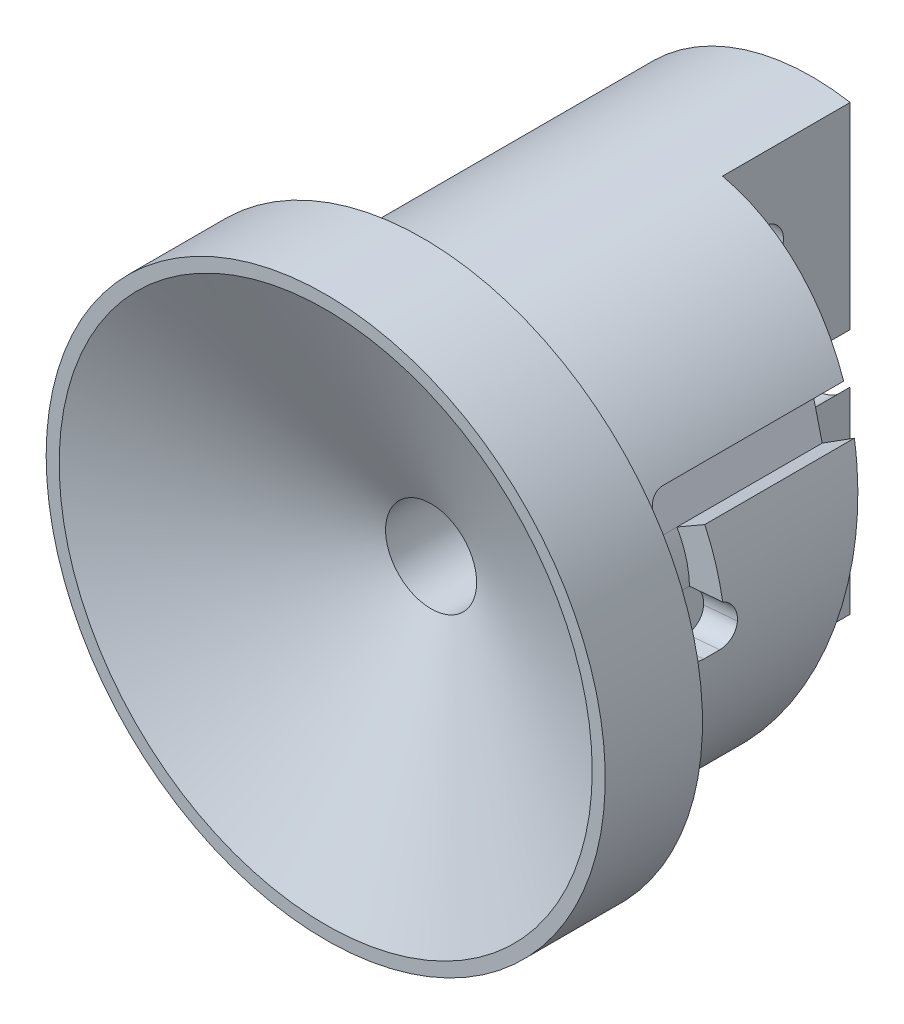
ISO-10303-21;
HEADER;
FILE_DESCRIPTION(('STEP AP214'),'2;1');
FILE_NAME('part.step','',(''),(''),'','','');
FILE_SCHEMA(('AUTOMOTIVE_DESIGN { 1 0 10303 214 1 1 1 1 }'));
ENDSEC;
DATA;
#1=APPLICATION_CONTEXT('core data for automotive mechanical design processes');
#2=APPLICATION_PROTOCOL_DEFINITION('international standard','automotive_design',2000,#1);
#3=PRODUCT_CONTEXT('',#1,'mechanical');
#4=PRODUCT('Part','Part','',(#3));
#5=PRODUCT_RELATED_PRODUCT_CATEGORY('part','',(#4));
#6=PRODUCT_DEFINITION_FORMATION('','',#4);
#7=PRODUCT_DEFINITION_CONTEXT('part definition',#1,'design');
#8=PRODUCT_DEFINITION('design','',#6,#7);
#9=PRODUCT_DEFINITION_SHAPE('','',#8);
#10=(LENGTH_UNIT() NAMED_UNIT(*) SI_UNIT(.MILLI.,.METRE.));
#11=(NAMED_UNIT(*) PLANE_ANGLE_UNIT() SI_UNIT($,.RADIAN.));
#12=(NAMED_UNIT(*) SI_UNIT($,.STERADIAN.) SOLID_ANGLE_UNIT());
#13=UNCERTAINTY_MEASURE_WITH_UNIT(LENGTH_MEASURE(1.E-05),#10,'distance_accuracy_value','');
#14=(GEOMETRIC_REPRESENTATION_CONTEXT(3) GLOBAL_UNCERTAINTY_ASSIGNED_CONTEXT((#13)) GLOBAL_UNIT_ASSIGNED_CONTEXT((#10,
#11,#12)) REPRESENTATION_CONTEXT('',''));
#15=CARTESIAN_POINT('',(0.,0.,0.));
#16=DIRECTION('',(0.,0.,1.));
#17=DIRECTION('',(1.,0.,0.));
#18=AXIS2_PLACEMENT_3D('',#15,#16,#17);
#19=CARTESIAN_POINT('',(12.4163792441114,1.08629242589841,-11.43));
#20=DIRECTION('',(-0.996194698091745,-0.0871557427476648,0.));
#21=DIRECTION('',(0.0871557427476648,-0.996194698091745,0.));
#22=AXIS2_PLACEMENT_3D('',#19,#20,#21);
#23=PLANE('',#22);
#24=DIRECTION('',(0.,0.,1.));
#25=VECTOR('',#24,1.);
#26=CARTESIAN_POINT('',(12.5303876711996,-0.216829858675404,-11.43));
#27=LINE('',#26,#25);
#28=CARTESIAN_POINT('',(12.5303876711996,-0.216829858675404,-11.0477431507776));
#29=VERTEX_POINT('',#28);
#30=CARTESIAN_POINT('',(12.5303876711996,-0.216829858675404,-10.0076));
#31=VERTEX_POINT('',#30);
#32=EDGE_CURVE('E184',#29,#31,#27,.T.);
#33=ORIENTED_EDGE('',*,*,#32,.F.);
#34=CARTESIAN_POINT('',(12.4263411455075,0.972427371906513,-11.0477431507776));
#35=DIRECTION('',(-0.996194698091745,-0.0871557427476648,0.));
#36=DIRECTION('',(0.0871557427476648,-0.996194698091745,0.));
#37=AXIS2_PLACEMENT_3D('',#34,#35,#36);
#38=CIRCLE('',#37,1.1938);
#39=CARTESIAN_POINT('',(12.4417284972035,0.796549137220463,-12.2284160588988));
#40=VERTEX_POINT('',#39);
#41=EDGE_CURVE('E60',#29,#40,#38,.F.);
#42=ORIENTED_EDGE('',*,*,#41,.T.);
#43=CARTESIAN_POINT('',(12.4248678884302,0.989266777355177,-10.9347));
#44=DIRECTION('',(0.996194698091745,0.0871557427476654,0.));
#45=DIRECTION('',(-0.0871557427476654,0.996194698091745,0.));
#46=AXIS2_PLACEMENT_3D('',#43,#44,#45);
#47=CIRCLE('',#46,1.3081);
#48=CARTESIAN_POINT('',(12.3193481056608,2.19536341338579,-11.43));
#49=VERTEX_POINT('',#48);
#50=EDGE_CURVE('E178',#40,#49,#47,.T.);
#51=ORIENTED_EDGE('',*,*,#50,.T.);
#52=DIRECTION('',(0.,0.,-1.));
#53=VECTOR('',#52,1.);
#54=CARTESIAN_POINT('',(12.3193481056608,2.19536341338579,-4.98224669027091));
#55=LINE('',#54,#53);
#56=CARTESIAN_POINT('',(12.3193481056608,2.19536341338579,-8.8138));
#57=VERTEX_POINT('',#56);
#58=EDGE_CURVE('E625',#57,#49,#55,.T.);
#59=ORIENTED_EDGE('',*,*,#58,.F.);
#60=DIRECTION('',(0.0871557427476648,-0.996194698091745,0.));
#61=VECTOR('',#60,1.);
#62=CARTESIAN_POINT('',(12.4163792441114,1.08629242589841,-8.8138));
#63=LINE('',#62,#61);
#64=CARTESIAN_POINT('',(12.4263411455075,0.972427371906522,-8.8138));
#65=VERTEX_POINT('',#64);
#66=EDGE_CURVE('E169',#57,#65,#63,.T.);
#67=ORIENTED_EDGE('',*,*,#66,.T.);
#68=CARTESIAN_POINT('',(12.4263411455075,0.972427371906522,-10.0076));
#69=DIRECTION('',(-0.996194698091745,-0.0871557427476648,0.));
#70=DIRECTION('',(0.0871557427476648,-0.996194698091745,0.));
#71=AXIS2_PLACEMENT_3D('',#68,#69,#70);
#72=CIRCLE('',#71,1.1938);
#73=EDGE_CURVE('E285',#65,#31,#72,.F.);
#74=ORIENTED_EDGE('',*,*,#73,.T.);
#75=EDGE_LOOP('',(#33,#42,#51,#59,#67,#74));
#76=FACE_BOUND('',#75,.T.);
#77=ADVANCED_FACE('F46',(#76),#23,.F.);
#78=CARTESIAN_POINT('',(0.,0.,-0.325495880631441));
#79=DIRECTION('',(0.,0.,-1.));
#80=DIRECTION('',(-1.,0.,0.));
#81=AXIS2_PLACEMENT_3D('',#78,#79,#80);
#82=CYLINDRICAL_SURFACE('',#81,14.6812);
#83=CARTESIAN_POINT('',(0.,0.,-6.35));
#84=DIRECTION('',(0.,0.,-1.));
#85=DIRECTION('',(-1.,0.,0.));
#86=AXIS2_PLACEMENT_3D('',#83,#84,#85);
#87=CIRCLE('',#86,14.6812);
#88=CARTESIAN_POINT('',(-14.6812,0.,-6.35));
#89=VERTEX_POINT('',#88);
#90=EDGE_CURVE('E246',#89,#89,#87,.T.);
#91=ORIENTED_EDGE('',*,*,#90,.T.);
#92=EDGE_LOOP('',(#91));
#93=FACE_BOUND('',#92,.T.);
#94=CARTESIAN_POINT('',(0.,0.,-11.43));
#95=DIRECTION('',(0.,0.,-1.));
#96=DIRECTION('',(-1.,0.,0.));
#97=AXIS2_PLACEMENT_3D('',#94,#95,#96);
#98=CIRCLE('',#97,14.6812);
#99=CARTESIAN_POINT('',(13.3177730257338,6.17855606715985,-11.43));
#100=VERTEX_POINT('',#99);
#101=CARTESIAN_POINT('',(14.4861901964781,2.3849375319831,-11.43));
#102=VERTEX_POINT('',#101);
#103=EDGE_CURVE('E174',#100,#102,#98,.T.);
#104=ORIENTED_EDGE('',*,*,#103,.T.);
#105=CARTESIAN_POINT('',(14.4861901964781,2.3849375319831,-11.43));
#106=CARTESIAN_POINT('',(14.4884613639518,2.37113892146036,-11.4640839324803));
#107=CARTESIAN_POINT('',(14.4909469978515,2.35592163119562,-11.4975599355647));
#108=CARTESIAN_POINT('',(14.4963016066078,2.32274827648895,-11.5630917175754));
#109=CARTESIAN_POINT('',(14.4991705585478,2.30479237576407,-11.5951475812514));
#110=CARTESIAN_POINT('',(14.5082748069592,2.24702314199613,-11.6887851744347));
#111=CARTESIAN_POINT('',(14.5150150036987,2.2032637948891,-11.7479464938295));
#112=CARTESIAN_POINT('',(14.5293750070234,2.10648592639315,-11.8580031221646));
#113=CARTESIAN_POINT('',(14.5369951813185,2.0534635295405,-11.9088949540572));
#114=CARTESIAN_POINT('',(14.5526203993969,1.93963040528132,-12.0009804680014));
#115=CARTESIAN_POINT('',(14.5606253725657,1.87882110346975,-12.0421759213184));
#116=CARTESIAN_POINT('',(14.576537633485,1.75109152865624,-12.1137040439891));
#117=CARTESIAN_POINT('',(14.5844449014716,1.68417004152981,-12.1440345492142));
#118=CARTESIAN_POINT('',(14.5997272511608,1.54609767566489,-12.1929541419579));
#119=CARTESIAN_POINT('',(14.607102277394,1.47494635750507,-12.2115420072372));
#120=CARTESIAN_POINT('',(14.6209501884581,1.33066995216013,-12.2363920347503));
#121=CARTESIAN_POINT('',(14.6274258299262,1.25755175459766,-12.2426926683214));
#122=CARTESIAN_POINT('',(14.6392703996066,1.11120858960278,-12.2429046032492));
#123=CARTESIAN_POINT('',(14.6446393414138,1.03798362349305,-12.2368160568067));
#124=CARTESIAN_POINT('',(14.6541548947385,0.893645242462607,-12.2124528028116));
#125=CARTESIAN_POINT('',(14.6583036793869,0.822528278854515,-12.1941999519649));
#126=CARTESIAN_POINT('',(14.6654071916949,0.684294374417719,-12.1460628447409));
#127=CARTESIAN_POINT('',(14.6683620518004,0.61717699060737,-12.1161798792521));
#128=CARTESIAN_POINT('',(14.6732064954826,0.488666124884252,-12.0455416585469));
#129=CARTESIAN_POINT('',(14.6750933912915,0.427287406482897,-12.0047593487301));
#130=CARTESIAN_POINT('',(14.6779937408499,0.312178358820198,-11.9135124207659));
#131=CARTESIAN_POINT('',(14.6790070080101,0.258449665492134,-11.8630457370473));
#132=CARTESIAN_POINT('',(14.6804218904452,0.159245895251082,-11.7527841678264));
#133=CARTESIAN_POINT('',(14.680811807414,0.113942466276904,-11.692833569748));
#134=CARTESIAN_POINT('',(14.6811136624675,0.0541648994216365,-11.5978162464266));
#135=CARTESIAN_POINT('',(14.6811670302523,0.0355888327049288,-11.5652633572206));
#136=CARTESIAN_POINT('',(14.6812098056202,0.00129355360213024,-11.498683736804));
#137=CARTESIAN_POINT('',(14.6811992098185,-0.014425507549017,-11.4646569276898));
#138=CARTESIAN_POINT('',(14.6811720243797,-0.028660610083196,-11.43));
#139=B_SPLINE_CURVE_WITH_KNOTS('',3,(#105,#106,#107,#108,#109,#110,#111,#112,#113,#114,#115,
#116,#117,#118,#119,#120,#121,#122,#123,#124,#125,#126,#127,#128,#129,#130,#131,#132,#133,#134,
#135,#136,#137,#138),.UNSPECIFIED.,.F.,.F.,(4,2,2,2,2,2,2,2,2,2,2,2,2,2,2,2,4),(0.,
0.110455309405497,0.22090401826105,0.441450437625067,0.662089350884358,0.882687928062333,
1.10333042064266,1.3239958751392,1.5439693094908,1.76394004148966,1.98351659398571,
2.20306878145643,2.42317109112525,2.64332039849976,2.86755466092752,2.97987594788759,
3.09220317881903),.UNSPECIFIED.);
#140=CARTESIAN_POINT('',(14.6478125129356,0.989556479382784,-12.2284160588988));
#141=VERTEX_POINT('',#140);
#142=EDGE_CURVE('E160',#102,#141,#139,.T.);
#143=ORIENTED_EDGE('',*,*,#142,.T.);
#144=CARTESIAN_POINT('',(14.6478125129356,0.989556479382784,-12.2284160588988));
#145=CARTESIAN_POINT('',(14.6500520617752,0.956414885802688,-12.2234497719461));
#146=CARTESIAN_POINT('',(14.6521625740862,0.923490699329103,-12.2170844377252));
#147=CARTESIAN_POINT('',(14.6561266797544,0.858282230564713,-12.2016024279582));
#148=CARTESIAN_POINT('',(14.6579802900503,0.825997906205256,-12.1924859339349));
#149=CARTESIAN_POINT('',(14.6631521672888,0.730511927722907,-12.1611134422584));
#150=CARTESIAN_POINT('',(14.6660889302212,0.668565530487546,-12.1348175692463));
#151=CARTESIAN_POINT('',(14.6710176288004,0.549922268249114,-12.0722187251337));
#152=CARTESIAN_POINT('',(14.6730091760995,0.493227568624937,-12.0359116505367));
#153=CARTESIAN_POINT('',(14.6762031903628,0.38669701296365,-11.9543239944428));
#154=CARTESIAN_POINT('',(14.6774058468479,0.336859511848389,-11.9090455716021));
#155=CARTESIAN_POINT('',(14.6792209558788,0.245374594432259,-11.8106954776694));
#156=CARTESIAN_POINT('',(14.6798323334249,0.203742204744798,-11.7576098133281));
#157=CARTESIAN_POINT('',(14.680671372986,0.129958071030313,-11.6451657160257));
#158=CARTESIAN_POINT('',(14.680898820731,0.0978116293300162,-11.5858037999342));
#159=CARTESIAN_POINT('',(14.6811588607807,0.043971541156054,-11.4625272929247));
#160=CARTESIAN_POINT('',(14.681191469244,0.0222770279981484,-11.3986130799922));
#161=CARTESIAN_POINT('',(14.6812059558936,-0.00998039306510226,-11.268137439148));
#162=CARTESIAN_POINT('',(14.6811879344012,-0.0205652571984908,-11.2015815034751));
#163=CARTESIAN_POINT('',(14.6811735472856,-0.0276040131707234,-11.1057329463568));
#164=CARTESIAN_POINT('',(14.6811706958382,-0.0286684031172335,-11.0767298307041));
#165=CARTESIAN_POINT('',(14.6811720243797,-0.0286606100832027,-11.0477431507776));
#166=B_SPLINE_CURVE_WITH_KNOTS('',3,(#144,#145,#146,#147,#148,#149,#150,#151,#152,#153,#154,
#155,#156,#157,#158,#159,#160,#161,#162,#163,#164,#165),.UNSPECIFIED.,.F.,.F.,(4,2,2,2,2,2,2,2,
2,2,4),(0.,0.100696848378733,0.201387054188759,0.402432056561508,0.603559588185072,
0.804638783804235,1.00608287651422,1.20763935734326,1.40917912203195,1.61031982519953,
1.69730434377564),.UNSPECIFIED.);
#167=CARTESIAN_POINT('',(14.6811720243797,-0.0286606100831969,-11.0477431507776));
#168=VERTEX_POINT('',#167);
#169=EDGE_CURVE('E13',#141,#168,#166,.T.);
#170=ORIENTED_EDGE('',*,*,#169,.T.);
#171=DIRECTION('',(0.,0.,1.));
#172=VECTOR('',#171,1.);
#173=CARTESIAN_POINT('',(14.6811720243797,-0.0286606100831969,-11.43));
#174=LINE('',#173,#172);
#175=CARTESIAN_POINT('',(14.6811720243797,-0.0286606100831969,-10.0076));
#176=VERTEX_POINT('',#175);
#177=EDGE_CURVE('E186',#168,#176,#174,.T.);
#178=ORIENTED_EDGE('',*,*,#177,.T.);
#179=CARTESIAN_POINT('',(14.6811720243797,-0.0286606100831969,-10.0076));
#180=CARTESIAN_POINT('',(14.6811713603819,-0.0286605230438289,-9.97408563546251));
#181=CARTESIAN_POINT('',(14.6811748663989,-0.0272427717737959,-9.94058738885749));
#182=CARTESIAN_POINT('',(14.6811845304353,-0.0215876829205685,-9.8738318693208));
#183=CARTESIAN_POINT('',(14.68119068829,-0.0173505205160749,-9.84057458154739));
#184=CARTESIAN_POINT('',(14.6812045930233,-0.000453664150254155,-9.74159048510479));
#185=CARTESIAN_POINT('',(14.6812078098013,0.0163915308899458,-9.67652869935269));
#186=CARTESIAN_POINT('',(14.6810908383812,0.0607567027563818,-9.55016116036319));
#187=CARTESIAN_POINT('',(14.6809705991541,0.0882810907647501,-9.48885697138397));
#188=CARTESIAN_POINT('',(14.6804363890432,0.153200837694031,-9.37172124193255));
#189=CARTESIAN_POINT('',(14.6800224525708,0.190595039879959,-9.31588906119583));
#190=CARTESIAN_POINT('',(14.6786972688968,0.274281353774743,-9.21113424513901));
#191=CARTESIAN_POINT('',(14.6777848159165,0.320594862330806,-9.16222872618486));
#192=CARTESIAN_POINT('',(14.6752549436024,0.42074894096606,-9.07284954191489));
#193=CARTESIAN_POINT('',(14.6736373854947,0.474590991341006,-9.03237753874161));
#194=CARTESIAN_POINT('',(14.6695155823306,0.588380160054187,-8.96094395595983));
#195=CARTESIAN_POINT('',(14.6670094195741,0.648340280904667,-8.93000321783209));
#196=CARTESIAN_POINT('',(14.6609910764105,0.772547009819359,-8.87865031721457));
#197=CARTESIAN_POINT('',(14.6574795068623,0.836790996991481,-8.85823178273492));
#198=CARTESIAN_POINT('',(14.6507889416689,0.945461627073592,-8.83354305630054));
#199=CARTESIAN_POINT('',(14.6479009496125,0.989221128629121,-8.82614487763141));
#200=CARTESIAN_POINT('',(14.6416949748365,1.07720193868941,-8.81627361018692));
#201=CARTESIAN_POINT('',(14.6383775752617,1.12142254745402,-8.81379391522364));
#202=CARTESIAN_POINT('',(14.6348522499863,1.16564705681955,-8.8138));
#203=B_SPLINE_CURVE_WITH_KNOTS('',3,(#179,#180,#181,#182,#183,#184,#185,#186,#187,#188,#189,
#190,#191,#192,#193,#194,#195,#196,#197,#198,#199,#200,#201,#202),.UNSPECIFIED.,.F.,.F.,(4,2,2,
2,2,2,2,2,2,2,2,4),(0.,0.10048113671173,0.200956030803738,0.401542288075423,0.602211488518851,
0.8028571811141,1.00399034458768,1.20516311152662,1.40677269924674,1.60826005322121,
1.74142420625145,1.87440938039694),.UNSPECIFIED.);
#204=CARTESIAN_POINT('',(14.6348522499863,1.16564705681955,-8.8138));
#205=VERTEX_POINT('',#204);
#206=EDGE_CURVE('E295',#176,#205,#203,.T.);
#207=ORIENTED_EDGE('',*,*,#206,.T.);
#208=CARTESIAN_POINT('',(0.,0.,-8.8138));
#209=DIRECTION('',(0.,0.,-1.));
#210=DIRECTION('',(-1.,0.,0.));
#211=AXIS2_PLACEMENT_3D('',#208,#209,#210);
#212=CIRCLE('',#211,14.6812);
#213=CARTESIAN_POINT('',(12.6567568233372,7.43936423055812,-8.8138));
#214=VERTEX_POINT('',#213);
#215=EDGE_CURVE('E198',#205,#214,#212,.F.);
#216=ORIENTED_EDGE('',*,*,#215,.T.);
#217=CARTESIAN_POINT('',(12.6567568233372,7.43936423055812,-8.8138));
#218=CARTESIAN_POINT('',(12.6397597788737,7.46828295212252,-8.81380015810687));
#219=CARTESIAN_POINT('',(12.6226705774063,7.49712876306233,-8.8152145949507));
#220=CARTESIAN_POINT('',(12.5884195945533,7.55449792981282,-8.82085647503839));
#221=CARTESIAN_POINT('',(12.5712578177808,7.58302130570696,-8.82508374208702));
#222=CARTESIAN_POINT('',(12.5198894231226,7.66774696235313,-8.84194156904666));
#223=CARTESIAN_POINT('',(12.4857380361821,7.72320965707814,-8.8587482841184));
#224=CARTESIAN_POINT('',(12.4187154652752,7.83052717895543,-8.90302146476721));
#225=CARTESIAN_POINT('',(12.3858448136072,7.88238051288315,-8.93049231164126));
#226=CARTESIAN_POINT('',(12.322454656725,7.98111440689049,-8.99530765608452));
#227=CARTESIAN_POINT('',(12.2919348705147,8.02799556154164,-9.03265097123783));
#228=CARTESIAN_POINT('',(12.2342228425561,8.11567569488978,-9.11625205562751));
#229=CARTESIAN_POINT('',(12.2070382409144,8.15646075385226,-9.16252968986431));
#230=CARTESIAN_POINT('',(12.1570375594092,8.23080088923721,-9.26265484131266));
#231=CARTESIAN_POINT('',(12.1342223196209,8.26435457547542,-9.31650381078207));
#232=CARTESIAN_POINT('',(12.0937823150095,8.32342180353166,-9.43031977384777));
#233=CARTESIAN_POINT('',(12.0761645636817,8.34892448453775,-9.49029488857362));
#234=CARTESIAN_POINT('',(12.0468408632733,8.39118133972652,-9.61459598954198));
#235=CARTESIAN_POINT('',(12.0351312922353,8.40794087403206,-9.6789192826759));
#236=CARTESIAN_POINT('',(12.0209857473769,8.4281451550881,-9.7876294569824));
#237=CARTESIAN_POINT('',(12.0167485960115,8.43418213385462,-9.83132608869502));
#238=CARTESIAN_POINT('',(12.0110913581152,8.44223457874028,-9.91920886554014));
#239=CARTESIAN_POINT('',(12.0096674778834,8.44425546059445,-9.96339427054197));
#240=CARTESIAN_POINT('',(12.0096730257338,8.4442517285407,-10.0076));
#241=B_SPLINE_CURVE_WITH_KNOTS('',3,(#217,#218,#219,#220,#221,#222,#223,#224,#225,#226,#227,
#228,#229,#230,#231,#232,#233,#234,#235,#236,#237,#238,#239,#240),.UNSPECIFIED.,.F.,.F.,(4,2,2,
2,2,2,2,2,2,2,2,4),(0.,0.100569590039991,0.201132881010322,0.401899054356789,0.60274779877107,
0.80357249861645,1.00484897434578,1.20616410971808,1.40774967022183,1.6092114998785,
1.74189925108982,1.87440795018741),.UNSPECIFIED.);
#242=CARTESIAN_POINT('',(12.0096730257338,8.4442517285407,-10.0076));
#243=VERTEX_POINT('',#242);
#244=EDGE_CURVE('E288',#214,#243,#241,.T.);
#245=ORIENTED_EDGE('',*,*,#244,.T.);
#246=DIRECTION('',(0.,0.,-1.));
#247=VECTOR('',#246,1.);
#248=CARTESIAN_POINT('',(12.0096730257338,8.4442517285407,-1.79195968761566));
#249=LINE('',#248,#247);
#250=CARTESIAN_POINT('',(12.0096730257338,8.4442517285407,-21.804570274537));
#251=VERTEX_POINT('',#250);
#252=EDGE_CURVE('E199',#243,#251,#249,.T.);
#253=ORIENTED_EDGE('',*,*,#252,.T.);
#254=CARTESIAN_POINT('',(0.,0.,-19.5419398431894));
#255=DIRECTION('',(0.,0.258819045102521,0.965925826289068));
#256=DIRECTION('',(0.,0.965925826289068,-0.258819045102522));
#257=AXIS2_PLACEMENT_3D('',#254,#255,#256);
#258=ELLIPSE('',#257,15.1990966598365,14.6812);
#259=CARTESIAN_POINT('',(2.4892,14.4686390790565,-23.4188));
#260=VERTEX_POINT('',#259);
#261=EDGE_CURVE('E258',#260,#251,#258,.F.);
#262=ORIENTED_EDGE('',*,*,#261,.F.);
#263=DIRECTION('',(0.,0.,-1.));
#264=VECTOR('',#263,1.);
#265=CARTESIAN_POINT('',(2.4892,14.4686390790565,-23.4188));
#266=LINE('',#265,#264);
#267=CARTESIAN_POINT('',(2.4892,14.4686390790565,-31.75));
#268=VERTEX_POINT('',#267);
#269=EDGE_CURVE('E221',#260,#268,#266,.T.);
#270=ORIENTED_EDGE('',*,*,#269,.T.);
#271=CARTESIAN_POINT('',(0.,0.,-31.75));
#272=DIRECTION('',(0.,0.,-1.));
#273=DIRECTION('',(-1.,0.,0.));
#274=AXIS2_PLACEMENT_3D('',#271,#272,#273);
#275=CIRCLE('',#274,14.6812);
#276=CARTESIAN_POINT('',(2.4892,-14.4686390790565,-31.75));
#277=VERTEX_POINT('',#276);
#278=EDGE_CURVE('E249',#277,#268,#275,.T.);
#279=ORIENTED_EDGE('',*,*,#278,.F.);
#280=DIRECTION('',(0.,0.,1.));
#281=VECTOR('',#280,1.);
#282=CARTESIAN_POINT('',(2.4892,-14.4686390790565,-31.75));
#283=LINE('',#282,#281);
#284=CARTESIAN_POINT('',(2.4892,-14.4686390790565,-15.6650796863788));
#285=VERTEX_POINT('',#284);
#286=EDGE_CURVE('E214',#277,#285,#283,.T.);
#287=ORIENTED_EDGE('',*,*,#286,.T.);
#288=CARTESIAN_POINT('',(13.3177730257338,6.17855606715985,-21.1974789517753));
#289=VERTEX_POINT('',#288);
#290=EDGE_CURVE('E255',#289,#285,#258,.F.);
#291=ORIENTED_EDGE('',*,*,#290,.F.);
#292=DIRECTION('',(0.,0.,-1.));
#293=VECTOR('',#292,1.);
#294=CARTESIAN_POINT('',(13.3177730257338,6.17855606715985,-1.79195968761566));
#295=LINE('',#294,#293);
#296=EDGE_CURVE('E183',#100,#289,#295,.T.);
#297=ORIENTED_EDGE('',*,*,#296,.F.);
#298=EDGE_LOOP('',(#104,#143,#170,#178,#207,#216,#245,#253,#262,#270,#279,#287,#291,#297));
#299=FACE_BOUND('',#298,.T.);
#300=ADVANCED_FACE('F181',(#93,#299),#82,.T.);
#301=CARTESIAN_POINT('',(0.,0.,-11.43));
#302=DIRECTION('',(0.,0.,-1.));
#303=DIRECTION('',(-1.,0.,0.));
#304=AXIS2_PLACEMENT_3D('',#301,#302,#303);
#305=PLANE('',#304);
#306=CARTESIAN_POINT('',(6.18343536424458,2.05954429780938,-11.43));
#307=DIRECTION('',(0.,0.,1.));
#308=DIRECTION('',(1.,0.,0.));
#309=AXIS2_PLACEMENT_3D('',#306,#307,#308);
#310=CIRCLE('',#309,6.13741574300042);
#311=CARTESIAN_POINT('',(11.4985933112695,5.12825216930959,-11.43));
#312=VERTEX_POINT('',#311);
#313=EDGE_CURVE('E177',#49,#312,#310,.T.);
#314=ORIENTED_EDGE('',*,*,#313,.F.);
#315=DIRECTION('',(-0.996194698091745,-0.0871557427476654,0.));
#316=VECTOR('',#315,1.);
#317=CARTESIAN_POINT('',(19.5987713062001,2.8322304204406,-11.43));
#318=LINE('',#317,#316);
#319=EDGE_CURVE('E164',#102,#49,#318,.T.);
#320=ORIENTED_EDGE('',*,*,#319,.F.);
#321=ORIENTED_EDGE('',*,*,#103,.F.);
#322=DIRECTION('',(0.866025403784438,0.500000000000001,0.));
#323=VECTOR('',#322,1.);
#324=CARTESIAN_POINT('',(13.3177730257338,6.17855606715985,-11.43));
#325=LINE('',#324,#323);
#326=EDGE_CURVE('E270',#312,#100,#325,.T.);
#327=ORIENTED_EDGE('',*,*,#326,.F.);
#328=EDGE_LOOP('',(#314,#320,#321,#327));
#329=FACE_BOUND('',#328,.T.);
#330=ADVANCED_FACE('F173',(#329),#305,.F.);
#331=CARTESIAN_POINT('',(0.,0.,-0.325495880631441));
#332=DIRECTION('',(0.,0.,-1.));
#333=DIRECTION('',(-1.,0.,0.));
#334=AXIS2_PLACEMENT_3D('',#331,#332,#333);
#335=CYLINDRICAL_SURFACE('',#334,2.9718);
#336=CARTESIAN_POINT('',(0.,0.,-6.88082662773722));
#337=DIRECTION('',(0.,0.,1.));
#338=DIRECTION('',(1.,0.,0.));
#339=AXIS2_PLACEMENT_3D('',#336,#337,#338);
#340=CIRCLE('',#339,2.9718);
#341=CARTESIAN_POINT('',(2.9718,0.,-6.88082662773722));
#342=VERTEX_POINT('',#341);
#343=EDGE_CURVE('E239',#342,#342,#340,.F.);
#344=ORIENTED_EDGE('',*,*,#343,.F.);
#345=EDGE_LOOP('',(#344));
#346=FACE_BOUND('',#345,.T.);
#347=CARTESIAN_POINT('',(0.,0.,-19.5419398431894));
#348=DIRECTION('',(0.,0.258819045102521,0.965925826289068));
#349=DIRECTION('',(0.,0.965925826289068,-0.258819045102522));
#350=AXIS2_PLACEMENT_3D('',#347,#348,#349);
#351=ELLIPSE('',#350,3.07663375294269,2.9718);
#352=CARTESIAN_POINT('',(2.4892,-1.62341572001752,-19.1069469120307));
#353=VERTEX_POINT('',#352);
#354=CARTESIAN_POINT('',(2.4892,1.62341572001752,-19.9769327743481));
#355=VERTEX_POINT('',#354);
#356=EDGE_CURVE('E234',#353,#355,#351,.T.);
#357=ORIENTED_EDGE('',*,*,#356,.F.);
#358=DIRECTION('',(0.,0.,-1.));
#359=VECTOR('',#358,1.);
#360=CARTESIAN_POINT('',(2.4892,-1.62341572001752,-0.325495880631441));
#361=LINE('',#360,#359);
#362=CARTESIAN_POINT('',(2.4892,-1.62341572001752,-31.75));
#363=VERTEX_POINT('',#362);
#364=EDGE_CURVE('E231',#353,#363,#361,.T.);
#365=ORIENTED_EDGE('',*,*,#364,.T.);
#366=CARTESIAN_POINT('',(0.,0.,-31.75));
#367=DIRECTION('',(0.,0.,-1.));
#368=DIRECTION('',(-1.,0.,0.));
#369=AXIS2_PLACEMENT_3D('',#366,#367,#368);
#370=CIRCLE('',#369,2.9718);
#371=CARTESIAN_POINT('',(2.4892,1.62341572001752,-31.75));
#372=VERTEX_POINT('',#371);
#373=EDGE_CURVE('E252',#363,#372,#370,.T.);
#374=ORIENTED_EDGE('',*,*,#373,.T.);
#375=DIRECTION('',(0.,0.,-1.));
#376=VECTOR('',#375,1.);
#377=CARTESIAN_POINT('',(2.4892,1.62341572001752,-0.325495880631441));
#378=LINE('',#377,#376);
#379=EDGE_CURVE('E228',#372,#355,#378,.F.);
#380=ORIENTED_EDGE('',*,*,#379,.T.);
#381=EDGE_LOOP('',(#357,#365,#374,#380));
#382=FACE_BOUND('',#381,.T.);
#383=ADVANCED_FACE('F318',(#346,#382),#335,.F.);
#384=CARTESIAN_POINT('',(0.,2.9718,-31.75));
#385=DIRECTION('',(0.,0.,-1.));
#386=DIRECTION('',(-1.,0.,0.));
#387=AXIS2_PLACEMENT_3D('',#384,#385,#386);
#388=PLANE('',#387);
#389=ORIENTED_EDGE('',*,*,#278,.T.);
#390=DIRECTION('',(0.,-1.,0.));
#391=VECTOR('',#390,1.);
#392=CARTESIAN_POINT('',(2.4892,14.4686390790565,-31.75));
#393=LINE('',#392,#391);
#394=EDGE_CURVE('E225',#268,#372,#393,.T.);
#395=ORIENTED_EDGE('',*,*,#394,.T.);
#396=ORIENTED_EDGE('',*,*,#373,.F.);
#397=EDGE_CURVE('E224',#363,#277,#393,.T.);
#398=ORIENTED_EDGE('',*,*,#397,.T.);
#399=EDGE_LOOP('',(#389,#395,#396,#398));
#400=FACE_BOUND('',#399,.T.);
#401=ADVANCED_FACE('F311',(#400),#388,.T.);
#402=CARTESIAN_POINT('',(0.,18.2499,0.));
#403=DIRECTION('',(0.,0.,1.));
#404=DIRECTION('',(1.,0.,0.));
#405=AXIS2_PLACEMENT_3D('',#402,#403,#404);
#406=PLANE('',#405);
#407=CARTESIAN_POINT('',(0.,0.,0.));
#408=DIRECTION('',(0.,0.,-1.));
#409=DIRECTION('',(-1.,0.,0.));
#410=AXIS2_PLACEMENT_3D('',#407,#408,#409);
#411=CIRCLE('',#410,17.399);
#412=CARTESIAN_POINT('',(17.399,0.,0.));
#413=VERTEX_POINT('',#412);
#414=EDGE_CURVE('E236',#413,#413,#411,.T.);
#415=ORIENTED_EDGE('',*,*,#414,.T.);
#416=EDGE_LOOP('',(#415));
#417=FACE_BOUND('',#416,.T.);
#418=CARTESIAN_POINT('',(0.,0.,0.));
#419=DIRECTION('',(0.,0.,-1.));
#420=DIRECTION('',(-1.,0.,0.));
#421=AXIS2_PLACEMENT_3D('',#418,#419,#420);
#422=CIRCLE('',#421,18.2499);
#423=CARTESIAN_POINT('',(-18.2499,0.,0.));
#424=VERTEX_POINT('',#423);
#425=EDGE_CURVE('E240',#424,#424,#422,.T.);
#426=ORIENTED_EDGE('',*,*,#425,.F.);
#427=EDGE_LOOP('',(#426));
#428=FACE_BOUND('',#427,.T.);
#429=ADVANCED_FACE('F317',(#417,#428),#406,.T.);
#430=CARTESIAN_POINT('',(0.,14.6812,-6.35));
#431=DIRECTION('',(0.,0.,-1.));
#432=DIRECTION('',(-1.,0.,0.));
#433=AXIS2_PLACEMENT_3D('',#430,#431,#432);
#434=PLANE('',#433);
#435=CARTESIAN_POINT('',(0.,0.,-6.35));
#436=DIRECTION('',(0.,0.,-1.));
#437=DIRECTION('',(-1.,0.,0.));
#438=AXIS2_PLACEMENT_3D('',#435,#436,#437);
#439=CIRCLE('',#438,18.2499);
#440=CARTESIAN_POINT('',(-18.2499,0.,-6.35));
#441=VERTEX_POINT('',#440);
#442=EDGE_CURVE('E243',#441,#441,#439,.T.);
#443=ORIENTED_EDGE('',*,*,#442,.T.);
#444=EDGE_LOOP('',(#443));
#445=FACE_BOUND('',#444,.T.);
#446=ORIENTED_EDGE('',*,*,#90,.F.);
#447=EDGE_LOOP('',(#446));
#448=FACE_BOUND('',#447,.T.);
#449=ADVANCED_FACE('F309',(#445,#448),#434,.T.);
#450=CARTESIAN_POINT('',(0.,0.,-0.325495880631441));
#451=DIRECTION('',(0.,0.,-1.));
#452=DIRECTION('',(-1.,0.,0.));
#453=AXIS2_PLACEMENT_3D('',#450,#451,#452);
#454=CYLINDRICAL_SURFACE('',#453,18.2499);
#455=ORIENTED_EDGE('',*,*,#425,.T.);
#456=EDGE_LOOP('',(#455));
#457=FACE_BOUND('',#456,.T.);
#458=ORIENTED_EDGE('',*,*,#442,.F.);
#459=EDGE_LOOP('',(#458));
#460=FACE_BOUND('',#459,.T.);
#461=ADVANCED_FACE('F327',(#457,#460),#454,.T.);
#462=CARTESIAN_POINT('',(0.,0.,-8.29818));
#463=DIRECTION('',(0.,0.,1.));
#464=DIRECTION('',(1.,0.,0.));
#465=AXIS2_PLACEMENT_3D('',#462,#463,#464);
#466=CONICAL_SURFACE('',#465,0.,1.12577095336052);
#467=CARTESIAN_POINT('',(2.9718,0.,-6.88082662773722));
#468=CARTESIAN_POINT('',(3.12208333333333,0.,-6.80915135036496));
#469=CARTESIAN_POINT('',(3.27236666666667,0.,-6.7374760729927));
#470=CARTESIAN_POINT('',(3.57293333333333,0.,-6.59412551824817));
#471=CARTESIAN_POINT('',(3.72321666666667,0.,-6.52245024087591));
#472=CARTESIAN_POINT('',(4.02378333333333,0.,-6.37909968613139));
#473=CARTESIAN_POINT('',(4.17406666666667,0.,-6.30742440875912));
#474=CARTESIAN_POINT('',(4.47463333333333,0.,-6.1640738540146));
#475=CARTESIAN_POINT('',(4.62491666666667,0.,-6.09239857664233));
#476=CARTESIAN_POINT('',(4.92548333333333,0.,-5.94904802189781));
#477=CARTESIAN_POINT('',(5.07576666666667,0.,-5.87737274452555));
#478=CARTESIAN_POINT('',(5.37633333333333,0.,-5.73402218978102));
#479=CARTESIAN_POINT('',(5.52661666666667,0.,-5.66234691240876));
#480=CARTESIAN_POINT('',(5.82718333333333,0.,-5.51899635766423));
#481=CARTESIAN_POINT('',(5.97746666666667,0.,-5.44732108029197));
#482=CARTESIAN_POINT('',(6.27803333333333,0.,-5.30397052554744));
#483=CARTESIAN_POINT('',(6.42831666666667,0.,-5.23229524817518));
#484=CARTESIAN_POINT('',(6.72888333333333,0.,-5.08894469343066));
#485=CARTESIAN_POINT('',(6.87916666666667,0.,-5.01726941605839));
#486=CARTESIAN_POINT('',(7.17973333333333,0.,-4.87391886131387));
#487=CARTESIAN_POINT('',(7.33001666666667,0.,-4.8022435839416));
#488=CARTESIAN_POINT('',(7.63058333333333,0.,-4.65889302919708));
#489=CARTESIAN_POINT('',(7.78086666666667,0.,-4.58721775182482));
#490=CARTESIAN_POINT('',(8.08143333333333,0.,-4.44386719708029));
#491=CARTESIAN_POINT('',(8.23171666666667,0.,-4.37219191970803));
#492=CARTESIAN_POINT('',(8.53228333333333,0.,-4.2288413649635));
#493=CARTESIAN_POINT('',(8.68256666666667,0.,-4.15716608759124));
#494=CARTESIAN_POINT('',(8.98313333333333,0.,-4.01381553284672));
#495=CARTESIAN_POINT('',(9.13341666666667,0.,-3.94214025547445));
#496=CARTESIAN_POINT('',(9.43398333333333,0.,-3.79878970072993));
#497=CARTESIAN_POINT('',(9.58426666666667,0.,-3.72711442335766));
#498=CARTESIAN_POINT('',(9.88483333333333,0.,-3.58376386861314));
#499=CARTESIAN_POINT('',(10.0351166666667,0.,-3.51208859124088));
#500=CARTESIAN_POINT('',(10.3356833333333,0.,-3.36873803649635));
#501=CARTESIAN_POINT('',(10.4859666666667,0.,-3.29706275912409));
#502=CARTESIAN_POINT('',(10.7865333333333,0.,-3.15371220437956));
#503=CARTESIAN_POINT('',(10.9368166666667,0.,-3.0820369270073));
#504=CARTESIAN_POINT('',(11.2373833333333,0.,-2.93868637226277));
#505=CARTESIAN_POINT('',(11.3876666666667,0.,-2.86701109489051));
#506=CARTESIAN_POINT('',(11.6882333333333,0.,-2.72366054014599));
#507=CARTESIAN_POINT('',(11.8385166666667,0.,-2.65198526277372));
#508=CARTESIAN_POINT('',(12.1390833333333,0.,-2.5086347080292));
#509=CARTESIAN_POINT('',(12.2893666666667,0.,-2.43695943065693));
#510=CARTESIAN_POINT('',(12.5899333333333,0.,-2.29360887591241));
#511=CARTESIAN_POINT('',(12.7402166666667,0.,-2.22193359854015));
#512=CARTESIAN_POINT('',(13.0407833333333,0.,-2.07858304379562));
#513=CARTESIAN_POINT('',(13.1910666666667,0.,-2.00690776642336));
#514=CARTESIAN_POINT('',(13.4916333333333,0.,-1.86355721167883));
#515=CARTESIAN_POINT('',(13.6419166666667,0.,-1.79188193430657));
#516=CARTESIAN_POINT('',(13.9424833333333,0.,-1.64853137956204));
#517=CARTESIAN_POINT('',(14.0927666666667,0.,-1.57685610218978));
#518=CARTESIAN_POINT('',(14.3933333333333,0.,-1.43350554744526));
#519=CARTESIAN_POINT('',(14.5436166666667,0.,-1.36183027007299));
#520=CARTESIAN_POINT('',(14.8441833333333,0.,-1.21847971532847));
#521=CARTESIAN_POINT('',(14.9944666666667,0.,-1.1468044379562));
#522=CARTESIAN_POINT('',(15.2950333333333,0.,-1.00345388321168));
#523=CARTESIAN_POINT('',(15.4453166666667,0.,-0.931778605839416));
#524=CARTESIAN_POINT('',(15.7458833333333,0.,-0.788428051094891));
#525=CARTESIAN_POINT('',(15.8961666666667,0.,-0.716752773722627));
#526=CARTESIAN_POINT('',(16.1967333333333,0.,-0.573402218978102));
#527=CARTESIAN_POINT('',(16.3470166666667,0.,-0.501726941605839));
#528=CARTESIAN_POINT('',(16.6475833333333,0.,-0.358376386861314));
#529=CARTESIAN_POINT('',(16.7978666666667,0.,-0.286701109489052));
#530=CARTESIAN_POINT('',(17.0984333333333,0.,-0.143350554744526));
#531=CARTESIAN_POINT('',(17.2487166666667,0.,-0.071675277372263));
#532=CARTESIAN_POINT('',(17.399,0.,0.));
#533=B_SPLINE_CURVE_WITH_KNOTS('',3,(#467,#468,#469,#470,#471,#472,#473,#474,#475,#476,#477,
#478,#479,#480,#481,#482,#483,#484,#485,#486,#487,#488,#489,#490,#491,#492,#493,#494,#495,#496,
#497,#498,#499,#500,#501,#502,#503,#504,#505,#506,#507,#508,#509,#510,#511,#512,#513,#514,#515,
#516,#517,#518,#519,#520,#521,#522,#523,#524,#525,#526,#527,#528,#529,#530,#531,#532),
.UNSPECIFIED.,.F.,.F.,(4,2,2,2,2,2,2,2,2,2,2,2,2,2,2,2,2,2,2,2,2,2,2,2,2,2,2,2,2,2,2,2,4),(0.,
0.49950158255757,0.99900316511514,1.49850474767271,1.99800633023028,2.49750791278785,
2.99700949534542,3.49651107790299,3.99601266046056,4.49551424301813,4.9950158255757,
5.49451740813327,5.99401899069084,6.49352057324841,6.99302215580598,7.49252373836355,
7.99202532092112,8.49152690347869,8.99102848603626,9.49053006859383,9.9900316511514,
10.489533233709,10.9890348162665,11.4885363988241,11.9880379813817,12.4875395639393,
12.9870411464968,13.4865427290544,13.986044311612,14.4855458941695,14.9850474767271,
15.4845490592847,15.9840506418422),.UNSPECIFIED.);
#534=EDGE_CURVE('BSEAM373',#342,#413,#533,.T.);
#535=ORIENTED_EDGE('',*,*,#343,.T.);
#536=ORIENTED_EDGE('',*,*,#414,.F.);
#537=ORIENTED_EDGE('',*,*,#534,.T.);
#538=ORIENTED_EDGE('',*,*,#534,.F.);
#539=EDGE_LOOP('',(#535,#537,#536,#538));
#540=FACE_BOUND('',#539,.T.);
#541=ADVANCED_FACE('F373',(#540),#466,.F.);
#542=CARTESIAN_POINT('',(2.4892,0.,0.));
#543=DIRECTION('',(1.,0.,0.));
#544=DIRECTION('',(0.,0.,-1.));
#545=AXIS2_PLACEMENT_3D('',#542,#543,#544);
#546=PLANE('',#545);
#547=DIRECTION('',(0.,0.965925826289068,-0.258819045102522));
#548=VECTOR('',#547,1.);
#549=CARTESIAN_POINT('',(2.4892,14.4686390790565,-23.4188));
#550=LINE('',#549,#548);
#551=EDGE_CURVE('E218',#285,#353,#550,.T.);
#552=ORIENTED_EDGE('',*,*,#551,.F.);
#553=ORIENTED_EDGE('',*,*,#286,.F.);
#554=ORIENTED_EDGE('',*,*,#397,.F.);
#555=ORIENTED_EDGE('',*,*,#364,.F.);
#556=EDGE_LOOP('',(#552,#553,#554,#555));
#557=FACE_BOUND('',#556,.T.);
#558=ADVANCED_FACE('F369',(#557),#546,.T.);
#559=CARTESIAN_POINT('',(18.2499,14.4686390790565,-23.4188));
#560=DIRECTION('',(0.,0.258819045102521,0.965925826289068));
#561=DIRECTION('',(0.,-0.965925826289068,0.258819045102522));
#562=AXIS2_PLACEMENT_3D('',#559,#560,#561);
#563=PLANE('',#562);
#564=ORIENTED_EDGE('',*,*,#261,.T.);
#565=DIRECTION('',(-0.858356263574048,-0.49557221983508,0.132788176096109));
#566=VECTOR('',#565,1.);
#567=CARTESIAN_POINT('',(19.3539473626824,12.6844704939805,-22.9407334684679));
#568=LINE('',#567,#566);
#569=CARTESIAN_POINT('',(10.1904933112695,7.39394783069043,-21.5231421933008));
#570=VERTEX_POINT('',#569);
#571=EDGE_CURVE('E267',#251,#570,#568,.T.);
#572=ORIENTED_EDGE('',*,*,#571,.T.);
#573=DIRECTION('',(0.487058473848149,-0.84361002296195,0.226044624379456));
#574=VECTOR('',#573,1.);
#575=CARTESIAN_POINT('',(8.98678606734056,9.47882993461405,-22.0817846693612));
#576=LINE('',#575,#574);
#577=CARTESIAN_POINT('',(11.4985933112695,5.12825216930959,-20.9160508705391));
#578=VERTEX_POINT('',#577);
#579=EDGE_CURVE('E264',#570,#578,#576,.T.);
#580=ORIENTED_EDGE('',*,*,#579,.T.);
#581=DIRECTION('',(0.858356263574048,0.495572219835079,-0.132788176096109));
#582=VECTOR('',#581,1.);
#583=CARTESIAN_POINT('',(20.731243366158,10.4587251638331,-22.3443468046976));
#584=LINE('',#583,#582);
#585=EDGE_CURVE('E261',#578,#289,#584,.T.);
#586=ORIENTED_EDGE('',*,*,#585,.T.);
#587=ORIENTED_EDGE('',*,*,#290,.T.);
#588=ORIENTED_EDGE('',*,*,#551,.T.);
#589=ORIENTED_EDGE('',*,*,#356,.T.);
#590=EDGE_CURVE('E217',#355,#260,#550,.T.);
#591=ORIENTED_EDGE('',*,*,#590,.T.);
#592=EDGE_LOOP('',(#564,#572,#580,#586,#587,#588,#589,#591));
#593=FACE_BOUND('',#592,.T.);
#594=ADVANCED_FACE('F367',(#593),#563,.F.);
#595=CARTESIAN_POINT('',(2.4892,8.9408,-26.0397983201345));
#596=DIRECTION('',(1.,0.,0.));
#597=DIRECTION('',(0.,0.,-1.));
#598=AXIS2_PLACEMENT_3D('',#595,#596,#597);
#599=CIRCLE('',#598,1.35255);
#600=CARTESIAN_POINT('',(2.4892,8.9408,-27.3923483201345));
#601=VERTEX_POINT('',#600);
#602=EDGE_CURVE('E202',#601,#601,#599,.T.);
#603=ORIENTED_EDGE('',*,*,#602,.F.);
#604=EDGE_LOOP('',(#603));
#605=FACE_BOUND('',#604,.T.);
#606=ORIENTED_EDGE('',*,*,#394,.F.);
#607=ORIENTED_EDGE('',*,*,#269,.F.);
#608=ORIENTED_EDGE('',*,*,#590,.F.);
#609=ORIENTED_EDGE('',*,*,#379,.F.);
#610=EDGE_LOOP('',(#606,#607,#608,#609));
#611=FACE_BOUND('',#610,.T.);
#612=ADVANCED_FACE('F363',(#605,#611),#546,.T.);
#613=CARTESIAN_POINT('',(-8.4836,8.9408,-26.0397983201345));
#614=DIRECTION('',(1.,0.,0.));
#615=DIRECTION('',(0.,0.,-1.));
#616=AXIS2_PLACEMENT_3D('',#613,#614,#615);
#617=CONICAL_SURFACE('',#616,1.35255,1.02974425867665);
#618=CARTESIAN_POINT('',(-9.29629403026573,8.9408,-26.0397983201345));
#619=VERTEX_POINT('',#618);
#620=VERTEX_LOOP('',#619);
#621=FACE_BOUND('',#620,.T.);
#622=CARTESIAN_POINT('',(-8.4836,8.9408,-26.0397983201345));
#623=DIRECTION('',(1.,0.,0.));
#624=DIRECTION('',(0.,0.,-1.));
#625=AXIS2_PLACEMENT_3D('',#622,#623,#624);
#626=CIRCLE('',#625,1.35255);
#627=CARTESIAN_POINT('',(-8.4836,8.9408,-27.3923483201345));
#628=VERTEX_POINT('',#627);
#629=EDGE_CURVE('E211',#628,#628,#626,.T.);
#630=ORIENTED_EDGE('',*,*,#629,.T.);
#631=EDGE_LOOP('',(#630));
#632=FACE_BOUND('',#631,.T.);
#633=ADVANCED_FACE('F359',(#621,#632),#617,.F.);
#634=CARTESIAN_POINT('',(2.4892,8.9408,-26.0397983201345));
#635=DIRECTION('',(1.,0.,0.));
#636=DIRECTION('',(0.,0.,-1.));
#637=AXIS2_PLACEMENT_3D('',#634,#635,#636);
#638=CYLINDRICAL_SURFACE('',#637,1.35255);
#639=ORIENTED_EDGE('',*,*,#629,.F.);
#640=EDGE_LOOP('',(#639));
#641=FACE_BOUND('',#640,.T.);
#642=ORIENTED_EDGE('',*,*,#602,.T.);
#643=EDGE_LOOP('',(#642));
#644=FACE_BOUND('',#643,.T.);
#645=ADVANCED_FACE('F349',(#641,#644),#638,.F.);
#646=CARTESIAN_POINT('',(10.1904933112695,7.39394783069043,-1.79195968761566));
#647=DIRECTION('',(-0.500000000000001,0.866025403784438,0.));
#648=DIRECTION('',(-0.866025403784438,-0.500000000000001,0.));
#649=AXIS2_PLACEMENT_3D('',#646,#647,#648);
#650=PLANE('',#649);
#651=ORIENTED_EDGE('',*,*,#252,.F.);
#652=DIRECTION('',(-0.866025403784438,-0.500000000000001,0.));
#653=VECTOR('',#652,1.);
#654=CARTESIAN_POINT('',(10.1904933112695,7.39394783069043,-10.0076));
#655=LINE('',#654,#653);
#656=CARTESIAN_POINT('',(10.1904933112695,7.39394783069043,-10.0076));
#657=VERTEX_POINT('',#656);
#658=EDGE_CURVE('E272',#243,#657,#655,.T.);
#659=ORIENTED_EDGE('',*,*,#658,.T.);
#660=DIRECTION('',(0.,0.,-1.));
#661=VECTOR('',#660,1.);
#662=CARTESIAN_POINT('',(10.1904933112695,7.39394783069043,-1.79195968761566));
#663=LINE('',#662,#661);
#664=EDGE_CURVE('E204',#657,#570,#663,.T.);
#665=ORIENTED_EDGE('',*,*,#664,.T.);
#666=ORIENTED_EDGE('',*,*,#571,.F.);
#667=EDGE_LOOP('',(#651,#659,#665,#666));
#668=FACE_BOUND('',#667,.T.);
#669=ADVANCED_FACE('F345',(#668),#650,.F.);
#670=CARTESIAN_POINT('',(11.4985933112695,5.12825216930959,-1.79195968761566));
#671=DIRECTION('',(-0.866025403784438,-0.500000000000001,0.));
#672=DIRECTION('',(0.500000000000001,-0.866025403784438,0.));
#673=AXIS2_PLACEMENT_3D('',#670,#671,#672);
#674=PLANE('',#673);
#675=DIRECTION('',(0.,0.,-1.));
#676=VECTOR('',#675,1.);
#677=CARTESIAN_POINT('',(11.4985933112695,5.12825216930959,-4.98224669027091));
#678=LINE('',#677,#676);
#679=CARTESIAN_POINT('',(11.4985933112695,5.12825216930959,-8.8138));
#680=VERTEX_POINT('',#679);
#681=EDGE_CURVE('E630',#680,#312,#678,.T.);
#682=ORIENTED_EDGE('',*,*,#681,.T.);
#683=DIRECTION('',(0.,0.,-1.));
#684=VECTOR('',#683,1.);
#685=CARTESIAN_POINT('',(11.4985933112695,5.12825216930959,-1.79195968761566));
#686=LINE('',#685,#684);
#687=EDGE_CURVE('E206',#312,#578,#686,.T.);
#688=ORIENTED_EDGE('',*,*,#687,.T.);
#689=ORIENTED_EDGE('',*,*,#579,.F.);
#690=ORIENTED_EDGE('',*,*,#664,.F.);
#691=CARTESIAN_POINT('',(10.7873933112695,6.36008670365257,-10.0076));
#692=DIRECTION('',(-0.866025403784438,-0.500000000000001,0.));
#693=DIRECTION('',(0.500000000000001,-0.866025403784438,0.));
#694=AXIS2_PLACEMENT_3D('',#691,#692,#693);
#695=CIRCLE('',#694,1.1938);
#696=CARTESIAN_POINT('',(10.7873933112695,6.36008670365257,-8.8138));
#697=VERTEX_POINT('',#696);
#698=EDGE_CURVE('E275',#657,#697,#695,.F.);
#699=ORIENTED_EDGE('',*,*,#698,.T.);
#700=DIRECTION('',(0.500000000000001,-0.866025403784438,0.));
#701=VECTOR('',#700,1.);
#702=CARTESIAN_POINT('',(11.4985933112695,5.12825216930959,-8.8138));
#703=LINE('',#702,#701);
#704=EDGE_CURVE('E196',#697,#680,#703,.T.);
#705=ORIENTED_EDGE('',*,*,#704,.T.);
#706=EDGE_LOOP('',(#682,#688,#689,#690,#699,#705));
#707=FACE_BOUND('',#706,.T.);
#708=ADVANCED_FACE('F348',(#707),#674,.F.);
#709=CARTESIAN_POINT('',(13.3177730257338,6.17855606715985,-1.79195968761566));
#710=DIRECTION('',(0.500000000000001,-0.866025403784438,0.));
#711=DIRECTION('',(0.866025403784438,0.500000000000001,0.));
#712=AXIS2_PLACEMENT_3D('',#709,#710,#711);
#713=PLANE('',#712);
#714=ORIENTED_EDGE('',*,*,#687,.F.);
#715=ORIENTED_EDGE('',*,*,#326,.T.);
#716=ORIENTED_EDGE('',*,*,#296,.T.);
#717=ORIENTED_EDGE('',*,*,#585,.F.);
#718=EDGE_LOOP('',(#714,#715,#716,#717));
#719=FACE_BOUND('',#718,.T.);
#720=ADVANCED_FACE('F343',(#719),#713,.F.);
#721=CARTESIAN_POINT('',(0.,14.6812,-8.8138));
#722=DIRECTION('',(0.,0.,-1.));
#723=DIRECTION('',(-1.,0.,0.));
#724=AXIS2_PLACEMENT_3D('',#721,#722,#723);
#725=PLANE('',#724);
#726=CARTESIAN_POINT('',(6.18343536424458,2.05954429780938,-8.8138));
#727=DIRECTION('',(0.,0.,-1.));
#728=DIRECTION('',(-1.,0.,0.));
#729=AXIS2_PLACEMENT_3D('',#726,#727,#728);
#730=CIRCLE('',#729,6.13741574300042);
#731=EDGE_CURVE('E627',#680,#57,#730,.T.);
#732=ORIENTED_EDGE('',*,*,#731,.F.);
#733=ORIENTED_EDGE('',*,*,#704,.F.);
#734=DIRECTION('',(-0.866025403784438,-0.500000000000001,0.));
#735=VECTOR('',#734,1.);
#736=CARTESIAN_POINT('',(6.29999607902006,3.76928670365258,-8.8138));
#737=LINE('',#736,#735);
#738=EDGE_CURVE('E280',#697,#214,#737,.F.);
#739=ORIENTED_EDGE('',*,*,#738,.T.);
#740=ORIENTED_EDGE('',*,*,#215,.F.);
#741=DIRECTION('',(0.996194698091745,0.0871557427476641,0.));
#742=VECTOR('',#741,1.);
#743=CARTESIAN_POINT('',(1.28464371437801,-0.00234484575328299,-8.8138));
#744=LINE('',#743,#742);
#745=EDGE_CURVE('E277',#205,#65,#744,.F.);
#746=ORIENTED_EDGE('',*,*,#745,.T.);
#747=ORIENTED_EDGE('',*,*,#66,.F.);
#748=EDGE_LOOP('',(#732,#733,#739,#740,#746,#747));
#749=FACE_BOUND('',#748,.T.);
#750=ADVANCED_FACE('F340',(#749),#725,.T.);
#751=CARTESIAN_POINT('',(0.114008427088219,-1.30312228457381,-11.43));
#752=DIRECTION('',(0.0871557427476641,-0.996194698091745,0.));
#753=DIRECTION('',(0.996194698091745,0.0871557427476641,0.));
#754=AXIS2_PLACEMENT_3D('',#751,#752,#753);
#755=PLANE('',#754);
#756=ORIENTED_EDGE('',*,*,#177,.F.);
#757=DIRECTION('',(-0.996194698091745,-0.0871557427476641,0.));
#758=VECTOR('',#757,1.);
#759=CARTESIAN_POINT('',(0.114008427088219,-1.30312228457381,-11.0477431507776));
#760=LINE('',#759,#758);
#761=EDGE_CURVE('E72',#168,#29,#760,.T.);
#762=ORIENTED_EDGE('',*,*,#761,.T.);
#763=ORIENTED_EDGE('',*,*,#32,.T.);
#764=DIRECTION('',(0.996194698091745,0.0871557427476641,0.));
#765=VECTOR('',#764,1.);
#766=CARTESIAN_POINT('',(0.114008427088219,-1.30312228457381,-10.0076));
#767=LINE('',#766,#765);
#768=EDGE_CURVE('E282',#31,#176,#767,.T.);
#769=ORIENTED_EDGE('',*,*,#768,.T.);
#770=EDGE_LOOP('',(#756,#762,#763,#769));
#771=FACE_BOUND('',#770,.T.);
#772=ADVANCED_FACE('F337',(#771),#755,.F.);
#773=CARTESIAN_POINT('',(19.7042910889695,1.62613378441002,-10.9347));
#774=DIRECTION('',(-0.996194698091745,-0.0871557427476654,0.));
#775=DIRECTION('',(0.0871557427476654,-0.996194698091745,0.));
#776=AXIS2_PLACEMENT_3D('',#773,#774,#775);
#777=CYLINDRICAL_SURFACE('',#776,1.3081);
#778=ORIENTED_EDGE('',*,*,#50,.F.);
#779=DIRECTION('',(-0.996194698091745,-0.0871557427476654,0.));
#780=VECTOR('',#779,1.);
#781=CARTESIAN_POINT('',(19.7211516977428,1.4334161442753,-12.2284160588988));
#782=LINE('',#781,#780);
#783=EDGE_CURVE('E167',#40,#141,#782,.F.);
#784=ORIENTED_EDGE('',*,*,#783,.T.);
#785=ORIENTED_EDGE('',*,*,#142,.F.);
#786=ORIENTED_EDGE('',*,*,#319,.T.);
#787=EDGE_LOOP('',(#778,#784,#785,#786));
#788=FACE_BOUND('',#787,.T.);
#789=ADVANCED_FACE('F163',(#788),#777,.F.);
#790=CARTESIAN_POINT('',(10.7873933112695,6.36008670365257,-10.0076));
#791=DIRECTION('',(-0.866025403784438,-0.500000000000001,0.));
#792=DIRECTION('',(0.500000000000001,-0.866025403784438,0.));
#793=AXIS2_PLACEMENT_3D('',#790,#791,#792);
#794=CYLINDRICAL_SURFACE('',#793,1.1938);
#795=ORIENTED_EDGE('',*,*,#244,.F.);
#796=ORIENTED_EDGE('',*,*,#738,.F.);
#797=ORIENTED_EDGE('',*,*,#698,.F.);
#798=ORIENTED_EDGE('',*,*,#658,.F.);
#799=EDGE_LOOP('',(#795,#796,#797,#798));
#800=FACE_BOUND('',#799,.T.);
#801=ADVANCED_FACE('F301',(#800),#794,.F.);
#802=CARTESIAN_POINT('',(0.00996190139605781,-0.113865053991884,-10.0076));
#803=DIRECTION('',(0.996194698091745,0.0871557427476641,0.));
#804=DIRECTION('',(-0.0871557427476641,0.996194698091745,0.));
#805=AXIS2_PLACEMENT_3D('',#802,#803,#804);
#806=CYLINDRICAL_SURFACE('',#805,1.1938);
#807=ORIENTED_EDGE('',*,*,#73,.F.);
#808=ORIENTED_EDGE('',*,*,#745,.F.);
#809=ORIENTED_EDGE('',*,*,#206,.F.);
#810=ORIENTED_EDGE('',*,*,#768,.F.);
#811=EDGE_LOOP('',(#807,#808,#809,#810));
#812=FACE_BOUND('',#811,.T.);
#813=ADVANCED_FACE('F452',(#812),#806,.F.);
#814=CARTESIAN_POINT('',(6.18343536424458,2.05954429780938,-4.98224669027091));
#815=DIRECTION('',(0.,0.,-1.));
#816=DIRECTION('',(-1.,0.,0.));
#817=AXIS2_PLACEMENT_3D('',#814,#815,#816);
#818=CYLINDRICAL_SURFACE('',#817,6.13741574300042);
#819=ORIENTED_EDGE('',*,*,#681,.F.);
#820=ORIENTED_EDGE('',*,*,#731,.T.);
#821=ORIENTED_EDGE('',*,*,#58,.T.);
#822=ORIENTED_EDGE('',*,*,#313,.T.);
#823=EDGE_LOOP('',(#819,#820,#821,#822));
#824=FACE_BOUND('',#823,.T.);
#825=ADVANCED_FACE('F459',(#824),#818,.T.);
#826=CARTESIAN_POINT('',(19.7057643460468,1.60929437896135,-11.0477431507776));
#827=DIRECTION('',(-0.996194698091745,-0.0871557427476654,0.));
#828=DIRECTION('',(0.0871557427476654,-0.996194698091745,0.));
#829=AXIS2_PLACEMENT_3D('',#826,#827,#828);
#830=CYLINDRICAL_SURFACE('',#829,1.1938);
#831=ORIENTED_EDGE('',*,*,#41,.F.);
#832=ORIENTED_EDGE('',*,*,#761,.F.);
#833=ORIENTED_EDGE('',*,*,#169,.F.);
#834=ORIENTED_EDGE('',*,*,#783,.F.);
#835=EDGE_LOOP('',(#831,#832,#833,#834));
#836=FACE_BOUND('',#835,.T.);
#837=ADVANCED_FACE('F48',(#836),#830,.F.);
#838=CLOSED_SHELL('',(#77,#300,#330,#383,#401,#429,#449,#461,#541,#558,#594,#612,#633,#645,#669,
#708,#720,#750,#772,#789,#801,#813,#825,#837));
#839=MANIFOLD_SOLID_BREP('B2',#838);
#840=ADVANCED_BREP_SHAPE_REPRESENTATION('',(#18,#839),#14);
#841=SHAPE_DEFINITION_REPRESENTATION(#9,#840);
ENDSEC;
END-ISO-10303-21;
